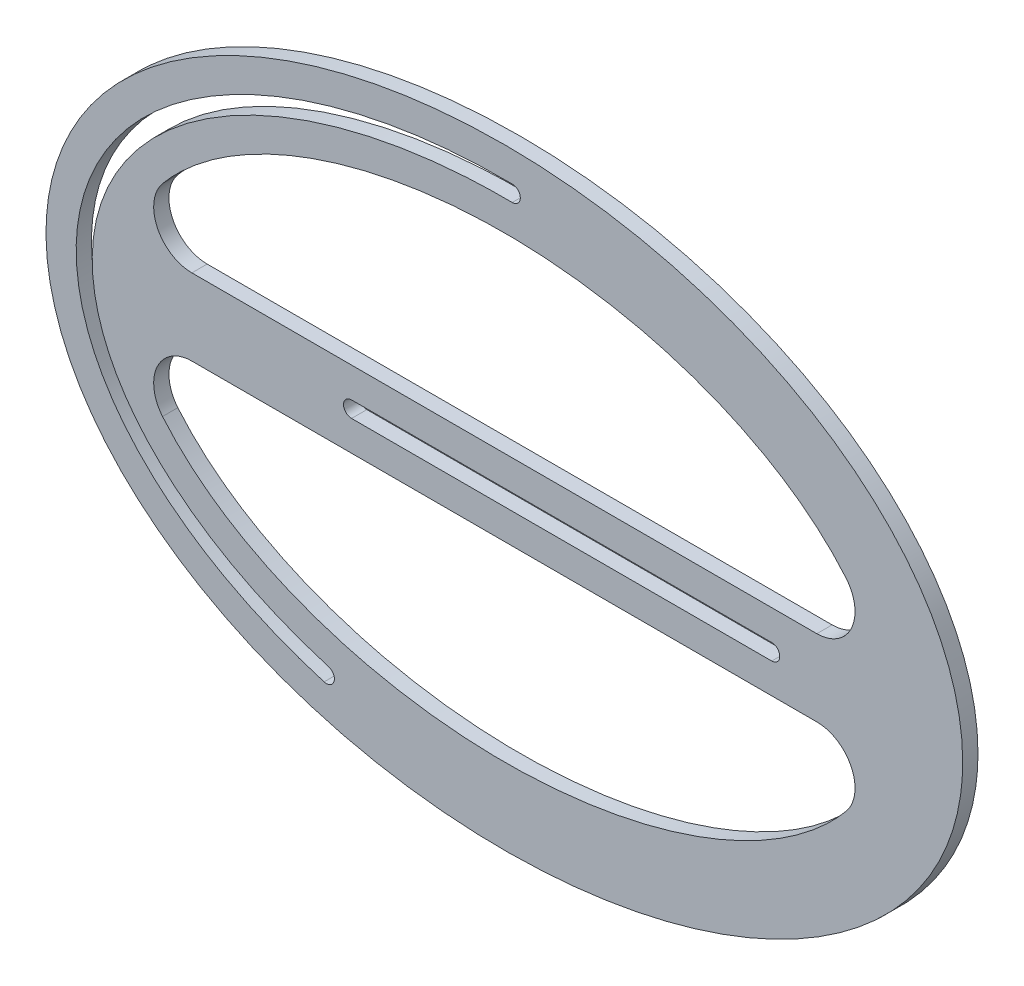
ISO-10303-21;
HEADER;
FILE_DESCRIPTION(('STEP AP214'),'2;1');
FILE_NAME('part.step','',(''),(''),'','','');
FILE_SCHEMA(('AUTOMOTIVE_DESIGN { 1 0 10303 214 1 1 1 1 }'));
ENDSEC;
DATA;
#1=APPLICATION_CONTEXT('core data for automotive mechanical design processes');
#2=APPLICATION_PROTOCOL_DEFINITION('international standard','automotive_design',2000,#1);
#3=PRODUCT_CONTEXT('',#1,'mechanical');
#4=PRODUCT('Part','Part','',(#3));
#5=PRODUCT_RELATED_PRODUCT_CATEGORY('part','',(#4));
#6=PRODUCT_DEFINITION_FORMATION('','',#4);
#7=PRODUCT_DEFINITION_CONTEXT('part definition',#1,'design');
#8=PRODUCT_DEFINITION('design','',#6,#7);
#9=PRODUCT_DEFINITION_SHAPE('','',#8);
#10=(LENGTH_UNIT() NAMED_UNIT(*) SI_UNIT(.MILLI.,.METRE.));
#11=(NAMED_UNIT(*) PLANE_ANGLE_UNIT() SI_UNIT($,.RADIAN.));
#12=(NAMED_UNIT(*) SI_UNIT($,.STERADIAN.) SOLID_ANGLE_UNIT());
#13=UNCERTAINTY_MEASURE_WITH_UNIT(LENGTH_MEASURE(1.E-05),#10,'distance_accuracy_value','');
#14=(GEOMETRIC_REPRESENTATION_CONTEXT(3) GLOBAL_UNCERTAINTY_ASSIGNED_CONTEXT((#13)) GLOBAL_UNIT_ASSIGNED_CONTEXT((#10,
#11,#12)) REPRESENTATION_CONTEXT('',''));
#15=CARTESIAN_POINT('',(0.,0.,0.));
#16=DIRECTION('',(0.,0.,1.));
#17=DIRECTION('',(1.,0.,0.));
#18=AXIS2_PLACEMENT_3D('',#15,#16,#17);
#19=CARTESIAN_POINT('',(100.,0.,2.));
#20=CARTESIAN_POINT('',(100.,3.55452568872866,2.));
#21=CARTESIAN_POINT('',(98.9138891933027,10.663577066186,2.));
#22=CARTESIAN_POINT('',(93.8521228578576,21.3831322021362,2.));
#23=CARTESIAN_POINT('',(85.1523454379762,31.7995776859009,2.));
#24=CARTESIAN_POINT('',(72.9290258901977,41.3098774176984,2.));
#25=CARTESIAN_POINT('',(57.6094970527651,49.3260714777289,2.));
#26=CARTESIAN_POINT('',(33.9052788591471,57.4076909095641,2.));
#27=CARTESIAN_POINT('',(0.,61.7282060602906,2.));
#28=CARTESIAN_POINT('',(-33.9052788591471,57.4076909095641,2.));
#29=CARTESIAN_POINT('',(-57.609497052765,49.3260714777288,2.));
#30=CARTESIAN_POINT('',(-72.9290258901977,41.3098774176984,2.));
#31=CARTESIAN_POINT('',(-85.1523454379762,31.7995776859009,2.));
#32=CARTESIAN_POINT('',(-93.8521228578576,21.3831322021362,2.));
#33=CARTESIAN_POINT('',(-98.9138891933027,10.663577066186,2.));
#34=CARTESIAN_POINT('',(-100.543055403349,0.,2.));
#35=CARTESIAN_POINT('',(-98.9138891933026,-10.663577066186,2.));
#36=CARTESIAN_POINT('',(-93.8521228578577,-21.3831322021362,2.));
#37=CARTESIAN_POINT('',(-85.1523454379762,-31.7995776859009,2.));
#38=CARTESIAN_POINT('',(-72.9290258901977,-41.3098774176984,2.));
#39=CARTESIAN_POINT('',(-57.6094970527651,-49.3260714777288,2.));
#40=CARTESIAN_POINT('',(-33.9052788591471,-57.4076909095641,2.));
#41=CARTESIAN_POINT('',(0.,-61.7282060602906,2.));
#42=CARTESIAN_POINT('',(33.9052788591471,-57.4076909095641,2.));
#43=CARTESIAN_POINT('',(57.609497052765,-49.3260714777288,2.));
#44=CARTESIAN_POINT('',(72.9290258901977,-41.3098774176984,2.));
#45=CARTESIAN_POINT('',(85.1523454379761,-31.799577685901,2.));
#46=CARTESIAN_POINT('',(93.8521228578577,-21.3831322021362,2.));
#47=CARTESIAN_POINT('',(98.9138891933026,-10.663577066186,2.));
#48=CARTESIAN_POINT('',(100.,-3.55452568872867,2.));
#49=CARTESIAN_POINT('',(100.,0.,2.));
#50=B_SPLINE_CURVE_WITH_KNOTS('',3,(#19,#20,#21,#22,#23,#24,#25,#26,#27,#28,#29,#30,#31,#32,#33,
#34,#35,#36,#37,#38,#39,#40,#41,#42,#43,#44,#45,#46,#47,#48,#49),.UNSPECIFIED.,.T.,.F.,(4,1,1,1,
1,1,1,1,1,1,1,1,1,1,1,1,1,1,1,1,1,1,1,1,1,1,1,1,4),(0.,0.196349540849362,0.392699081698724,
0.589048622548086,0.785398163397448,0.98174770424681,1.17809724509617,1.5707963267949,
1.96349540849362,2.15984494934298,2.35619449019234,2.55254403104171,2.74889357189107,
2.94524311274043,3.14159265358979,3.33794219443916,3.53429173528852,3.73064127613788,
3.92699081698724,4.1233403578366,4.31968989868597,4.71238898038469,5.10508806208341,
5.30143760293278,5.49778714378214,5.6941366846315,5.89048622548086,6.08683576633022,
6.28318530717959),.UNSPECIFIED.);
#51=DIRECTION('',(0.,0.,-1.));
#52=VECTOR('',#51,1.);
#53=SURFACE_OF_LINEAR_EXTRUSION('',#50,#52);
#54=CARTESIAN_POINT('',(-89.4891679912321,-26.4034784966226,2.));
#55=VERTEX_POINT('',#54);
#56=CARTESIAN_POINT('',(89.489167991232,-26.4034784966227,2.));
#57=VERTEX_POINT('',#56);
#58=EDGE_CURVE('E311',#55,#57,#50,.T.);
#59=ORIENTED_EDGE('',*,*,#58,.T.);
#60=DIRECTION('',(0.,0.,-1.));
#61=VECTOR('',#60,1.);
#62=CARTESIAN_POINT('',(89.489167991232,-26.4034784966227,2.));
#63=LINE('',#62,#61);
#64=CARTESIAN_POINT('',(89.489167991232,-26.4034784966227,-2.));
#65=VERTEX_POINT('',#64);
#66=EDGE_CURVE('E384',#57,#65,#63,.T.);
#67=ORIENTED_EDGE('',*,*,#66,.T.);
#68=CARTESIAN_POINT('',(100.,0.,-2.));
#69=CARTESIAN_POINT('',(100.,3.55452568872866,-2.));
#70=CARTESIAN_POINT('',(98.9138891933027,10.663577066186,-2.));
#71=CARTESIAN_POINT('',(93.8521228578576,21.3831322021362,-2.));
#72=CARTESIAN_POINT('',(85.1523454379762,31.7995776859009,-2.));
#73=CARTESIAN_POINT('',(72.9290258901977,41.3098774176984,-2.));
#74=CARTESIAN_POINT('',(57.6094970527651,49.3260714777289,-2.));
#75=CARTESIAN_POINT('',(33.9052788591471,57.4076909095641,-2.));
#76=CARTESIAN_POINT('',(0.,61.7282060602906,-2.));
#77=CARTESIAN_POINT('',(-33.9052788591471,57.4076909095641,-2.));
#78=CARTESIAN_POINT('',(-57.609497052765,49.3260714777288,-2.));
#79=CARTESIAN_POINT('',(-72.9290258901977,41.3098774176984,-2.));
#80=CARTESIAN_POINT('',(-85.1523454379762,31.7995776859009,-2.));
#81=CARTESIAN_POINT('',(-93.8521228578576,21.3831322021362,-2.));
#82=CARTESIAN_POINT('',(-98.9138891933027,10.663577066186,-2.));
#83=CARTESIAN_POINT('',(-100.543055403349,0.,-2.));
#84=CARTESIAN_POINT('',(-98.9138891933026,-10.663577066186,-2.));
#85=CARTESIAN_POINT('',(-93.8521228578577,-21.3831322021362,-2.));
#86=CARTESIAN_POINT('',(-85.1523454379762,-31.7995776859009,-2.));
#87=CARTESIAN_POINT('',(-72.9290258901977,-41.3098774176984,-2.));
#88=CARTESIAN_POINT('',(-57.6094970527651,-49.3260714777288,-2.));
#89=CARTESIAN_POINT('',(-33.9052788591471,-57.4076909095641,-2.));
#90=CARTESIAN_POINT('',(0.,-61.7282060602906,-2.));
#91=CARTESIAN_POINT('',(33.9052788591471,-57.4076909095641,-2.));
#92=CARTESIAN_POINT('',(57.609497052765,-49.3260714777288,-2.));
#93=CARTESIAN_POINT('',(72.9290258901977,-41.3098774176984,-2.));
#94=CARTESIAN_POINT('',(85.1523454379761,-31.799577685901,-2.));
#95=CARTESIAN_POINT('',(93.8521228578577,-21.3831322021362,-2.));
#96=CARTESIAN_POINT('',(98.9138891933026,-10.663577066186,-2.));
#97=CARTESIAN_POINT('',(100.,-3.55452568872867,-2.));
#98=CARTESIAN_POINT('',(100.,0.,-2.));
#99=B_SPLINE_CURVE_WITH_KNOTS('',3,(#68,#69,#70,#71,#72,#73,#74,#75,#76,#77,#78,#79,#80,#81,#82,
#83,#84,#85,#86,#87,#88,#89,#90,#91,#92,#93,#94,#95,#96,#97,#98),.UNSPECIFIED.,.T.,.F.,(4,1,1,1,
1,1,1,1,1,1,1,1,1,1,1,1,1,1,1,1,1,1,1,1,1,1,1,1,4),(0.,0.196349540849362,0.392699081698724,
0.589048622548086,0.785398163397448,0.98174770424681,1.17809724509617,1.5707963267949,
1.96349540849362,2.15984494934298,2.35619449019234,2.55254403104171,2.74889357189107,
2.94524311274043,3.14159265358979,3.33794219443916,3.53429173528852,3.73064127613788,
3.92699081698724,4.1233403578366,4.31968989868597,4.71238898038469,5.10508806208341,
5.30143760293278,5.49778714378214,5.6941366846315,5.89048622548086,6.08683576633022,
6.28318530717959),.UNSPECIFIED.);
#100=CARTESIAN_POINT('',(-89.4891679912321,-26.4034784966226,-2.));
#101=VERTEX_POINT('',#100);
#102=EDGE_CURVE('E323',#101,#65,#99,.T.);
#103=ORIENTED_EDGE('',*,*,#102,.F.);
#104=DIRECTION('',(0.,0.,-1.));
#105=VECTOR('',#104,1.);
#106=CARTESIAN_POINT('',(-89.4891679912321,-26.4034784966226,-2.));
#107=LINE('',#106,#105);
#108=EDGE_CURVE('E387',#101,#55,#107,.F.);
#109=ORIENTED_EDGE('',*,*,#108,.T.);
#110=EDGE_LOOP('',(#59,#67,#103,#109));
#111=FACE_BOUND('',#110,.T.);
#112=ADVANCED_FACE('F57',(#111),#53,.T.);
#113=CARTESIAN_POINT('',(-120.,0.,2.));
#114=DIRECTION('',(0.,0.,-1.));
#115=DIRECTION('',(-1.,0.,0.));
#116=AXIS2_PLACEMENT_3D('',#113,#114,#115);
#117=PLANE('',#116);
#118=DIRECTION('',(1.,0.,0.));
#119=VECTOR('',#118,1.);
#120=CARTESIAN_POINT('',(-40.,-2.1,2.));
#121=LINE('',#120,#119);
#122=CARTESIAN_POINT('',(-40.,-2.1,2.));
#123=VERTEX_POINT('',#122);
#124=CARTESIAN_POINT('',(70.,-2.09999999999998,2.));
#125=VERTEX_POINT('',#124);
#126=EDGE_CURVE('E234',#123,#125,#121,.T.);
#127=ORIENTED_EDGE('',*,*,#126,.F.);
#128=CARTESIAN_POINT('',(-40.,0.,2.));
#129=DIRECTION('',(0.,0.,1.));
#130=DIRECTION('',(1.,0.,0.));
#131=AXIS2_PLACEMENT_3D('',#128,#129,#130);
#132=CIRCLE('',#131,2.1);
#133=CARTESIAN_POINT('',(-40.,2.1,2.));
#134=VERTEX_POINT('',#133);
#135=EDGE_CURVE('E240',#134,#123,#132,.T.);
#136=ORIENTED_EDGE('',*,*,#135,.F.);
#137=DIRECTION('',(-1.,0.,0.));
#138=VECTOR('',#137,1.);
#139=CARTESIAN_POINT('',(-40.,2.1,2.));
#140=LINE('',#139,#138);
#141=CARTESIAN_POINT('',(70.,2.10000000000002,2.));
#142=VERTEX_POINT('',#141);
#143=EDGE_CURVE('E244',#142,#134,#140,.T.);
#144=ORIENTED_EDGE('',*,*,#143,.F.);
#145=CARTESIAN_POINT('',(70.,0.,2.));
#146=DIRECTION('',(0.,0.,1.));
#147=DIRECTION('',(1.,0.,0.));
#148=AXIS2_PLACEMENT_3D('',#145,#146,#147);
#149=CIRCLE('',#148,2.1);
#150=EDGE_CURVE('E222',#125,#142,#149,.T.);
#151=ORIENTED_EDGE('',*,*,#150,.F.);
#152=EDGE_LOOP('',(#127,#136,#144,#151));
#153=FACE_BOUND('',#152,.T.);
#154=CARTESIAN_POINT('',(2.07629801618386,69.9874737524133,2.));
#155=DIRECTION('',(0.,0.,-1.));
#156=DIRECTION('',(-1.,0.,0.));
#157=AXIS2_PLACEMENT_3D('',#154,#155,#156);
#158=CIRCLE('',#157,2.1);
#159=CARTESIAN_POINT('',(2.10142726215118,72.0873233948871,2.));
#160=VERTEX_POINT('',#159);
#161=CARTESIAN_POINT('',(4.17568457840183,69.9367188277396,2.));
#162=VERTEX_POINT('',#161);
#163=EDGE_CURVE('E466',#160,#162,#158,.T.);
#164=ORIENTED_EDGE('',*,*,#163,.T.);
#165=CARTESIAN_POINT('',(2.07629792702465,69.9874700645021,2.));
#166=DIRECTION('',(0.,0.,-1.));
#167=DIRECTION('',(-1.,0.,0.));
#168=AXIS2_PLACEMENT_3D('',#165,#166,#167);
#169=CIRCLE('',#168,2.1);
#170=CARTESIAN_POINT('',(2.05117519981623,67.8876203440274,2.));
#171=VERTEX_POINT('',#170);
#172=EDGE_CURVE('E471',#162,#171,#169,.T.);
#173=ORIENTED_EDGE('',*,*,#172,.T.);
#174=CARTESIAN_POINT('',(-44.0056818239766,-61.9737632172946,2.));
#175=CARTESIAN_POINT('',(-45.4238606673335,-61.5737305547639,2.));
#176=CARTESIAN_POINT('',(-48.2603499056449,-60.7267452837837,2.));
#177=CARTESIAN_POINT('',(-53.7813952717234,-58.8884871139168,2.));
#178=CARTESIAN_POINT('',(-60.4432611079557,-56.3085696023602,2.));
#179=CARTESIAN_POINT('',(-67.9729968814889,-52.7920451013287,2.));
#180=CARTESIAN_POINT('',(-77.3248739171352,-47.579038076013,2.));
#181=CARTESIAN_POINT('',(-87.5869033047087,-40.1594313813924,2.));
#182=CARTESIAN_POINT('',(-97.2530750916108,-30.103801291565,2.));
#183=CARTESIAN_POINT('',(-104.006165257759,-19.2271844201019,2.));
#184=CARTESIAN_POINT('',(-108.924460755741,-4.07953196371148,2.));
#185=CARTESIAN_POINT('',(-107.265727293647,15.3192353851775,2.));
#186=CARTESIAN_POINT('',(-92.8192461903909,37.1433574182495,2.));
#187=CARTESIAN_POINT('',(-71.4945118665523,51.8620549345535,2.));
#188=CARTESIAN_POINT('',(-50.3868762344104,60.399589228256,2.));
#189=CARTESIAN_POINT('',(-33.025936973881,64.9892229316607,2.));
#190=CARTESIAN_POINT('',(-14.6675599564208,67.6151125814292,2.));
#191=CARTESIAN_POINT('',(-2.11393454607107,68.0009907980665,2.));
#192=CARTESIAN_POINT('',(4.12523958610341,67.8501520631694,2.));
#193=B_SPLINE_CURVE_WITH_KNOTS('',3,(#174,#175,#176,#177,#178,#179,#180,#181,#182,#183,#184,
#185,#186,#187,#188,#189,#190,#191,#192),.UNSPECIFIED.,.F.,.F.,(4,1,1,1,1,1,1,1,1,1,1,1,1,1,1,1,
4),(-1.60876903824375,-1.56560763089935,-1.52244622355495,-1.43612340886616,-1.34980059417736,
-1.26347777948857,-1.09083215011098,-0.918186520733392,-0.745540891355803,-0.572895261978214,
-0.227604003223037,0.117687255532141,0.462978514287319,0.635624143664908,0.808269773042497,
0.980915402420086,1.15356103179767),.UNSPECIFIED.);
#194=CARTESIAN_POINT('',(-45.9938940113434,-61.3975562299335,2.));
#195=VERTEX_POINT('',#194);
#196=EDGE_CURVE('E256',#195,#171,#193,.T.);
#197=ORIENTED_EDGE('',*,*,#196,.F.);
#198=CARTESIAN_POINT('',(-46.5928468043653,-63.4103293298459,2.));
#199=DIRECTION('',(0.,0.,-1.));
#200=DIRECTION('',(-1.,0.,0.));
#201=AXIS2_PLACEMENT_3D('',#198,#199,#200);
#202=CIRCLE('',#201,2.1);
#203=CARTESIAN_POINT('',(-44.5717149594898,-63.980439903007,2.));
#204=VERTEX_POINT('',#203);
#205=EDGE_CURVE('E85',#195,#204,#202,.T.);
#206=ORIENTED_EDGE('',*,*,#205,.T.);
#207=CARTESIAN_POINT('',(-46.5928477421218,-63.4103326543406,2.));
#208=DIRECTION('',(0.,0.,-1.));
#209=DIRECTION('',(-1.,0.,0.));
#210=AXIS2_PLACEMENT_3D('',#207,#208,#209);
#211=CIRCLE('',#210,2.1);
#212=CARTESIAN_POINT('',(-47.1917985336607,-65.4231063498451,2.));
#213=VERTEX_POINT('',#212);
#214=EDGE_CURVE('E67',#204,#213,#211,.T.);
#215=ORIENTED_EDGE('',*,*,#214,.T.);
#216=CARTESIAN_POINT('',(4.2267494354509,72.0489251876053,2.));
#217=CARTESIAN_POINT('',(-2.16655572989241,72.2034902057506,2.));
#218=CARTESIAN_POINT('',(-15.0268583594118,71.8082923939363,2.));
#219=CARTESIAN_POINT('',(-33.8542445418859,69.1161903813619,2.));
#220=CARTESIAN_POINT('',(-51.7031344796899,64.3997947482921,2.));
#221=CARTESIAN_POINT('',(-73.4972763222923,55.5870585463929,2.));
#222=CARTESIAN_POINT('',(-95.7690966917872,40.2712085704439,2.));
#223=CARTESIAN_POINT('',(-108.753782536943,20.7977147237653,2.));
#224=CARTESIAN_POINT('',(-112.498680523617,4.04983235177222,2.));
#225=CARTESIAN_POINT('',(-111.871960538631,-8.65394962539672,2.));
#226=CARTESIAN_POINT('',(-107.836151502222,-21.0502963531823,2.));
#227=CARTESIAN_POINT('',(-100.567006326947,-32.733684024488,2.));
#228=CARTESIAN_POINT('',(-90.3290633649762,-43.3697792852495,2.));
#229=CARTESIAN_POINT('',(-79.5959399831508,-51.1231391454755,2.));
#230=CARTESIAN_POINT('',(-69.8817285211462,-56.537296625925,2.));
#231=CARTESIAN_POINT('',(-62.0878987171337,-60.1765999448417,2.));
#232=CARTESIAN_POINT('',(-55.2126090532504,-62.8388701192126,2.));
#233=CARTESIAN_POINT('',(-49.5239316189691,-64.7328656935595,2.));
#234=CARTESIAN_POINT('',(-46.6055469284552,-65.6042979761965,2.));
#235=CARTESIAN_POINT('',(-45.1459029702987,-66.0160269070456,2.));
#236=B_SPLINE_CURVE_WITH_KNOTS('',3,(#216,#217,#218,#219,#220,#221,#222,#223,#224,#225,#226,
#227,#228,#229,#230,#231,#232,#233,#234,#235),.UNSPECIFIED.,.F.,.F.,(4,1,1,1,1,1,1,1,1,1,1,1,1,
1,1,1,1,4),(-1.60876903824375,-1.43612340886616,-1.26347777948857,-1.09083215011098,
-0.918186520733392,-0.572895261978214,-0.227604003223037,-0.0549583738454478,0.117687255532141,
0.29033288490973,0.462978514287319,0.635624143664908,0.808269773042497,0.894592587731291,
0.980915402420086,1.06723821710888,1.11039962445328,1.15356103179767),.UNSPECIFIED.);
#237=EDGE_CURVE('E269',#160,#213,#236,.T.);
#238=ORIENTED_EDGE('',*,*,#237,.F.);
#239=EDGE_LOOP('',(#164,#173,#197,#206,#215,#238));
#240=FACE_BOUND('',#239,.T.);
#241=ORIENTED_EDGE('',*,*,#58,.F.);
#242=CARTESIAN_POINT('',(-81.8083175732581,-19.9999999999999,2.));
#243=DIRECTION('',(0.,0.,-1.));
#244=DIRECTION('',(-1.,0.,0.));
#245=AXIS2_PLACEMENT_3D('',#242,#243,#244);
#246=CIRCLE('',#245,10.);
#247=CARTESIAN_POINT('',(-81.8083175732581,-10.,2.));
#248=VERTEX_POINT('',#247);
#249=EDGE_CURVE('E438',#55,#248,#246,.T.);
#250=ORIENTED_EDGE('',*,*,#249,.T.);
#251=DIRECTION('',(1.,0.,0.));
#252=VECTOR('',#251,1.);
#253=CARTESIAN_POINT('',(110.,-10.,2.));
#254=LINE('',#253,#252);
#255=CARTESIAN_POINT('',(81.8083175732581,-10.,2.));
#256=VERTEX_POINT('',#255);
#257=EDGE_CURVE('E519',#248,#256,#254,.T.);
#258=ORIENTED_EDGE('',*,*,#257,.T.);
#259=CARTESIAN_POINT('',(81.8083175732581,-20.,2.));
#260=DIRECTION('',(0.,0.,-1.));
#261=DIRECTION('',(-1.,0.,0.));
#262=AXIS2_PLACEMENT_3D('',#259,#260,#261);
#263=CIRCLE('',#262,10.);
#264=EDGE_CURVE('E393',#256,#57,#263,.T.);
#265=ORIENTED_EDGE('',*,*,#264,.T.);
#266=EDGE_LOOP('',(#241,#250,#258,#265));
#267=FACE_BOUND('',#266,.T.);
#268=CARTESIAN_POINT('',(89.4891679912319,26.4034784966228,2.));
#269=VERTEX_POINT('',#268);
#270=CARTESIAN_POINT('',(-89.4891679912321,26.4034784966226,2.));
#271=VERTEX_POINT('',#270);
#272=EDGE_CURVE('E302',#269,#271,#50,.T.);
#273=ORIENTED_EDGE('',*,*,#272,.F.);
#274=CARTESIAN_POINT('',(81.808317573258,20.0000000000001,2.));
#275=DIRECTION('',(0.,0.,-1.));
#276=DIRECTION('',(-1.,0.,0.));
#277=AXIS2_PLACEMENT_3D('',#274,#275,#276);
#278=CIRCLE('',#277,10.);
#279=CARTESIAN_POINT('',(81.808317573258,10.,2.));
#280=VERTEX_POINT('',#279);
#281=EDGE_CURVE('E427',#269,#280,#278,.T.);
#282=ORIENTED_EDGE('',*,*,#281,.T.);
#283=DIRECTION('',(-1.,0.,0.));
#284=VECTOR('',#283,1.);
#285=CARTESIAN_POINT('',(110.,10.,2.));
#286=LINE('',#285,#284);
#287=CARTESIAN_POINT('',(-81.8083175732581,10.,2.));
#288=VERTEX_POINT('',#287);
#289=EDGE_CURVE('E511',#280,#288,#286,.T.);
#290=ORIENTED_EDGE('',*,*,#289,.T.);
#291=CARTESIAN_POINT('',(-81.8083175732581,20.,2.));
#292=DIRECTION('',(0.,0.,-1.));
#293=DIRECTION('',(-1.,0.,0.));
#294=AXIS2_PLACEMENT_3D('',#291,#292,#293);
#295=CIRCLE('',#294,10.);
#296=EDGE_CURVE('E430',#288,#271,#295,.T.);
#297=ORIENTED_EDGE('',*,*,#296,.T.);
#298=EDGE_LOOP('',(#273,#282,#290,#297));
#299=FACE_BOUND('',#298,.T.);
#300=CARTESIAN_POINT('',(120.,0.,2.));
#301=CARTESIAN_POINT('',(120.,5.60837091024374,2.));
#302=CARTESIAN_POINT('',(118.249749071403,16.8251127307312,2.));
#303=CARTESIAN_POINT('',(110.711713347938,32.5379791037427,2.));
#304=CARTESIAN_POINT('',(98.949654389036,46.4813704803415,2.));
#305=CARTESIAN_POINT('',(78.5354843174125,62.2718289704446,2.));
#306=CARTESIAN_POINT('',(45.6898819848852,76.1580302699827,2.));
#307=CARTESIAN_POINT('',(0.,81.9209848650086,2.));
#308=CARTESIAN_POINT('',(-45.6898819848852,76.1580302699827,2.));
#309=CARTESIAN_POINT('',(-78.5354843174124,62.2718289704445,2.));
#310=CARTESIAN_POINT('',(-98.949654389036,46.4813704803415,2.));
#311=CARTESIAN_POINT('',(-110.711713347938,32.5379791037428,2.));
#312=CARTESIAN_POINT('',(-118.249749071403,16.8251127307312,2.));
#313=CARTESIAN_POINT('',(-120.875125464299,0.,2.));
#314=CARTESIAN_POINT('',(-118.249749071403,-16.8251127307312,2.));
#315=CARTESIAN_POINT('',(-110.711713347938,-32.5379791037427,2.));
#316=CARTESIAN_POINT('',(-98.949654389036,-46.4813704803415,2.));
#317=CARTESIAN_POINT('',(-78.5354843174125,-62.2718289704445,2.));
#318=CARTESIAN_POINT('',(-45.6898819848853,-76.1580302699826,2.));
#319=CARTESIAN_POINT('',(0.,-81.9209848650087,2.));
#320=CARTESIAN_POINT('',(45.6898819848852,-76.1580302699826,2.));
#321=CARTESIAN_POINT('',(78.5354843174125,-62.2718289704446,2.));
#322=CARTESIAN_POINT('',(98.949654389036,-46.4813704803415,2.));
#323=CARTESIAN_POINT('',(110.711713347938,-32.5379791037428,2.));
#324=CARTESIAN_POINT('',(118.249749071403,-16.8251127307313,2.));
#325=CARTESIAN_POINT('',(120.,-5.60837091024375,2.));
#326=CARTESIAN_POINT('',(120.,0.,2.));
#327=B_SPLINE_CURVE_WITH_KNOTS('',3,(#300,#301,#302,#303,#304,#305,#306,#307,#308,#309,#310,
#311,#312,#313,#314,#315,#316,#317,#318,#319,#320,#321,#322,#323,#324,#325,#326),.UNSPECIFIED.,
.T.,.F.,(4,1,1,1,1,1,1,1,1,1,1,1,1,1,1,1,1,1,1,1,1,1,1,1,4),(0.,0.196349540849362,
0.392699081698724,0.589048622548086,0.785398163397448,1.17809724509617,1.5707963267949,
1.96349540849362,2.35619449019234,2.55254403104171,2.74889357189107,2.94524311274043,
3.14159265358979,3.33794219443916,3.53429173528852,3.73064127613788,3.92699081698724,
4.31968989868597,4.71238898038469,5.10508806208341,5.49778714378214,5.6941366846315,
5.89048622548086,6.08683576633022,6.28318530717959),.UNSPECIFIED.);
#328=CARTESIAN_POINT('',(120.,0.,2.));
#329=VERTEX_POINT('',#328);
#330=EDGE_CURVE('E324',#329,#329,#327,.T.);
#331=ORIENTED_EDGE('',*,*,#330,.T.);
#332=EDGE_LOOP('',(#331));
#333=FACE_BOUND('',#332,.T.);
#334=ADVANCED_FACE('F242',(#153,#240,#267,#299,#333),#117,.F.);
#335=CARTESIAN_POINT('',(-120.,0.,-2.));
#336=DIRECTION('',(0.,0.,-1.));
#337=DIRECTION('',(-1.,0.,0.));
#338=AXIS2_PLACEMENT_3D('',#335,#336,#337);
#339=PLANE('',#338);
#340=CARTESIAN_POINT('',(-40.,0.,-2.));
#341=DIRECTION('',(0.,0.,-1.));
#342=DIRECTION('',(-1.,0.,0.));
#343=AXIS2_PLACEMENT_3D('',#340,#341,#342);
#344=CIRCLE('',#343,2.1);
#345=CARTESIAN_POINT('',(-40.,-2.1,-2.));
#346=VERTEX_POINT('',#345);
#347=CARTESIAN_POINT('',(-40.,2.1,-2.));
#348=VERTEX_POINT('',#347);
#349=EDGE_CURVE('E449',#346,#348,#344,.T.);
#350=ORIENTED_EDGE('',*,*,#349,.F.);
#351=DIRECTION('',(-1.,0.,0.));
#352=VECTOR('',#351,1.);
#353=CARTESIAN_POINT('',(-120.,-2.10000000000002,-2.));
#354=LINE('',#353,#352);
#355=CARTESIAN_POINT('',(70.,-2.09999999999998,-2.));
#356=VERTEX_POINT('',#355);
#357=EDGE_CURVE('E441',#356,#346,#354,.T.);
#358=ORIENTED_EDGE('',*,*,#357,.F.);
#359=CARTESIAN_POINT('',(70.,0.,-2.));
#360=DIRECTION('',(0.,0.,-1.));
#361=DIRECTION('',(-1.,0.,0.));
#362=AXIS2_PLACEMENT_3D('',#359,#360,#361);
#363=CIRCLE('',#362,2.1);
#364=CARTESIAN_POINT('',(70.,2.10000000000002,-2.));
#365=VERTEX_POINT('',#364);
#366=EDGE_CURVE('E225',#365,#356,#363,.T.);
#367=ORIENTED_EDGE('',*,*,#366,.F.);
#368=DIRECTION('',(1.,0.,0.));
#369=VECTOR('',#368,1.);
#370=CARTESIAN_POINT('',(-120.,2.09999999999999,-2.));
#371=LINE('',#370,#369);
#372=EDGE_CURVE('E446',#348,#365,#371,.T.);
#373=ORIENTED_EDGE('',*,*,#372,.F.);
#374=EDGE_LOOP('',(#350,#358,#367,#373));
#375=FACE_BOUND('',#374,.T.);
#376=CARTESIAN_POINT('',(4.2267494354509,72.0489251876053,-2.));
#377=CARTESIAN_POINT('',(-2.16655572989241,72.2034902057506,-2.));
#378=CARTESIAN_POINT('',(-15.0268583594118,71.8082923939363,-2.));
#379=CARTESIAN_POINT('',(-33.8542445418859,69.1161903813619,-2.));
#380=CARTESIAN_POINT('',(-51.7031344796899,64.3997947482921,-2.));
#381=CARTESIAN_POINT('',(-73.4972763222923,55.5870585463929,-2.));
#382=CARTESIAN_POINT('',(-95.7690966917872,40.2712085704439,-2.));
#383=CARTESIAN_POINT('',(-108.753782536943,20.7977147237653,-2.));
#384=CARTESIAN_POINT('',(-112.498680523617,4.04983235177222,-2.));
#385=CARTESIAN_POINT('',(-111.871960538631,-8.65394962539672,-2.));
#386=CARTESIAN_POINT('',(-107.836151502222,-21.0502963531823,-2.));
#387=CARTESIAN_POINT('',(-100.567006326947,-32.733684024488,-2.));
#388=CARTESIAN_POINT('',(-90.3290633649762,-43.3697792852495,-2.));
#389=CARTESIAN_POINT('',(-79.5959399831508,-51.1231391454755,-2.));
#390=CARTESIAN_POINT('',(-69.8817285211462,-56.537296625925,-2.));
#391=CARTESIAN_POINT('',(-62.0878987171337,-60.1765999448417,-2.));
#392=CARTESIAN_POINT('',(-55.2126090532504,-62.8388701192126,-2.));
#393=CARTESIAN_POINT('',(-49.5239316189691,-64.7328656935595,-2.));
#394=CARTESIAN_POINT('',(-46.6055469284552,-65.6042979761965,-2.));
#395=CARTESIAN_POINT('',(-45.1459029702987,-66.0160269070456,-2.));
#396=B_SPLINE_CURVE_WITH_KNOTS('',3,(#376,#377,#378,#379,#380,#381,#382,#383,#384,#385,#386,
#387,#388,#389,#390,#391,#392,#393,#394,#395),.UNSPECIFIED.,.F.,.F.,(4,1,1,1,1,1,1,1,1,1,1,1,1,
1,1,1,1,4),(-1.60876903824375,-1.43612340886616,-1.26347777948857,-1.09083215011098,
-0.918186520733392,-0.572895261978214,-0.227604003223037,-0.0549583738454478,0.117687255532141,
0.29033288490973,0.462978514287319,0.635624143664908,0.808269773042497,0.894592587731291,
0.980915402420086,1.06723821710888,1.11039962445328,1.15356103179767),.UNSPECIFIED.);
#397=CARTESIAN_POINT('',(2.10142726215118,72.0873233948871,-2.));
#398=VERTEX_POINT('',#397);
#399=CARTESIAN_POINT('',(-47.1917985336607,-65.4231063498451,-2.));
#400=VERTEX_POINT('',#399);
#401=EDGE_CURVE('E268',#398,#400,#396,.T.);
#402=ORIENTED_EDGE('',*,*,#401,.T.);
#403=CARTESIAN_POINT('',(-46.5928477421218,-63.4103326543406,-2.));
#404=DIRECTION('',(0.,0.,-1.));
#405=DIRECTION('',(-1.,0.,0.));
#406=AXIS2_PLACEMENT_3D('',#403,#404,#405);
#407=CIRCLE('',#406,2.1);
#408=CARTESIAN_POINT('',(-44.5717149594898,-63.980439903007,-2.));
#409=VERTEX_POINT('',#408);
#410=EDGE_CURVE('E13',#400,#409,#407,.F.);
#411=ORIENTED_EDGE('',*,*,#410,.T.);
#412=CARTESIAN_POINT('',(-46.5928468043653,-63.4103293298459,-2.));
#413=DIRECTION('',(0.,0.,-1.));
#414=DIRECTION('',(-1.,0.,0.));
#415=AXIS2_PLACEMENT_3D('',#412,#413,#414);
#416=CIRCLE('',#415,2.1);
#417=CARTESIAN_POINT('',(-45.9938940113434,-61.3975562299335,-2.));
#418=VERTEX_POINT('',#417);
#419=EDGE_CURVE('E479',#409,#418,#416,.F.);
#420=ORIENTED_EDGE('',*,*,#419,.T.);
#421=CARTESIAN_POINT('',(-44.0056818239766,-61.9737632172946,-2.));
#422=CARTESIAN_POINT('',(-45.4238606673335,-61.5737305547639,-2.));
#423=CARTESIAN_POINT('',(-48.2603499056449,-60.7267452837837,-2.));
#424=CARTESIAN_POINT('',(-53.7813952717234,-58.8884871139168,-2.));
#425=CARTESIAN_POINT('',(-60.4432611079557,-56.3085696023602,-2.));
#426=CARTESIAN_POINT('',(-67.9729968814889,-52.7920451013287,-2.));
#427=CARTESIAN_POINT('',(-77.3248739171352,-47.579038076013,-2.));
#428=CARTESIAN_POINT('',(-87.5869033047087,-40.1594313813924,-2.));
#429=CARTESIAN_POINT('',(-97.2530750916108,-30.103801291565,-2.));
#430=CARTESIAN_POINT('',(-104.006165257759,-19.2271844201019,-2.));
#431=CARTESIAN_POINT('',(-108.924460755741,-4.07953196371148,-2.));
#432=CARTESIAN_POINT('',(-107.265727293647,15.3192353851775,-2.));
#433=CARTESIAN_POINT('',(-92.8192461903909,37.1433574182495,-2.));
#434=CARTESIAN_POINT('',(-71.4945118665523,51.8620549345535,-2.));
#435=CARTESIAN_POINT('',(-50.3868762344104,60.399589228256,-2.));
#436=CARTESIAN_POINT('',(-33.025936973881,64.9892229316607,-2.));
#437=CARTESIAN_POINT('',(-14.6675599564208,67.6151125814292,-2.));
#438=CARTESIAN_POINT('',(-2.11393454607107,68.0009907980665,-2.));
#439=CARTESIAN_POINT('',(4.12523958610341,67.8501520631694,-2.));
#440=B_SPLINE_CURVE_WITH_KNOTS('',3,(#421,#422,#423,#424,#425,#426,#427,#428,#429,#430,#431,
#432,#433,#434,#435,#436,#437,#438,#439),.UNSPECIFIED.,.F.,.F.,(4,1,1,1,1,1,1,1,1,1,1,1,1,1,1,1,
4),(-1.60876903824375,-1.56560763089935,-1.52244622355495,-1.43612340886616,-1.34980059417736,
-1.26347777948857,-1.09083215011098,-0.918186520733392,-0.745540891355803,-0.572895261978214,
-0.227604003223037,0.117687255532141,0.462978514287319,0.635624143664908,0.808269773042497,
0.980915402420086,1.15356103179767),.UNSPECIFIED.);
#441=CARTESIAN_POINT('',(2.05117519981623,67.8876203440274,-2.));
#442=VERTEX_POINT('',#441);
#443=EDGE_CURVE('E261',#418,#442,#440,.T.);
#444=ORIENTED_EDGE('',*,*,#443,.T.);
#445=CARTESIAN_POINT('',(2.07629792702465,69.9874700645021,-2.));
#446=DIRECTION('',(0.,0.,-1.));
#447=DIRECTION('',(-1.,0.,0.));
#448=AXIS2_PLACEMENT_3D('',#445,#446,#447);
#449=CIRCLE('',#448,2.1);
#450=CARTESIAN_POINT('',(4.17568457840183,69.9367188277396,-2.));
#451=VERTEX_POINT('',#450);
#452=EDGE_CURVE('E474',#442,#451,#449,.F.);
#453=ORIENTED_EDGE('',*,*,#452,.T.);
#454=CARTESIAN_POINT('',(2.07629801618386,69.9874737524133,-2.));
#455=DIRECTION('',(0.,0.,-1.));
#456=DIRECTION('',(-1.,0.,0.));
#457=AXIS2_PLACEMENT_3D('',#454,#455,#456);
#458=CIRCLE('',#457,2.1);
#459=EDGE_CURVE('E468',#451,#398,#458,.F.);
#460=ORIENTED_EDGE('',*,*,#459,.T.);
#461=EDGE_LOOP('',(#402,#411,#420,#444,#453,#460));
#462=FACE_BOUND('',#461,.T.);
#463=DIRECTION('',(1.,0.,0.));
#464=VECTOR('',#463,1.);
#465=CARTESIAN_POINT('',(110.,-10.,-2.));
#466=LINE('',#465,#464);
#467=CARTESIAN_POINT('',(-81.8083175732581,-10.,-2.));
#468=VERTEX_POINT('',#467);
#469=CARTESIAN_POINT('',(81.8083175732581,-10.,-2.));
#470=VERTEX_POINT('',#469);
#471=EDGE_CURVE('E518',#468,#470,#466,.T.);
#472=ORIENTED_EDGE('',*,*,#471,.F.);
#473=CARTESIAN_POINT('',(-81.8083175732581,-19.9999999999999,-2.));
#474=DIRECTION('',(0.,0.,-1.));
#475=DIRECTION('',(-1.,0.,0.));
#476=AXIS2_PLACEMENT_3D('',#473,#474,#475);
#477=CIRCLE('',#476,10.);
#478=EDGE_CURVE('E435',#468,#101,#477,.F.);
#479=ORIENTED_EDGE('',*,*,#478,.T.);
#480=ORIENTED_EDGE('',*,*,#102,.T.);
#481=CARTESIAN_POINT('',(81.8083175732581,-20.,-2.));
#482=DIRECTION('',(0.,0.,-1.));
#483=DIRECTION('',(-1.,0.,0.));
#484=AXIS2_PLACEMENT_3D('',#481,#482,#483);
#485=CIRCLE('',#484,10.);
#486=EDGE_CURVE('E395',#65,#470,#485,.F.);
#487=ORIENTED_EDGE('',*,*,#486,.T.);
#488=EDGE_LOOP('',(#472,#479,#480,#487));
#489=FACE_BOUND('',#488,.T.);
#490=DIRECTION('',(-1.,0.,0.));
#491=VECTOR('',#490,1.);
#492=CARTESIAN_POINT('',(110.,10.,-2.));
#493=LINE('',#492,#491);
#494=CARTESIAN_POINT('',(81.808317573258,10.,-2.));
#495=VERTEX_POINT('',#494);
#496=CARTESIAN_POINT('',(-81.8083175732581,10.,-2.));
#497=VERTEX_POINT('',#496);
#498=EDGE_CURVE('E312',#495,#497,#493,.T.);
#499=ORIENTED_EDGE('',*,*,#498,.F.);
#500=CARTESIAN_POINT('',(81.808317573258,20.0000000000001,-2.));
#501=DIRECTION('',(0.,0.,-1.));
#502=DIRECTION('',(-1.,0.,0.));
#503=AXIS2_PLACEMENT_3D('',#500,#501,#502);
#504=CIRCLE('',#503,10.);
#505=CARTESIAN_POINT('',(89.4891679912319,26.4034784966228,-2.));
#506=VERTEX_POINT('',#505);
#507=EDGE_CURVE('E424',#495,#506,#504,.F.);
#508=ORIENTED_EDGE('',*,*,#507,.T.);
#509=CARTESIAN_POINT('',(-89.4891679912321,26.4034784966226,-2.));
#510=VERTEX_POINT('',#509);
#511=EDGE_CURVE('E314',#506,#510,#99,.T.);
#512=ORIENTED_EDGE('',*,*,#511,.T.);
#513=CARTESIAN_POINT('',(-81.8083175732581,20.,-2.));
#514=DIRECTION('',(0.,0.,-1.));
#515=DIRECTION('',(-1.,0.,0.));
#516=AXIS2_PLACEMENT_3D('',#513,#514,#515);
#517=CIRCLE('',#516,10.);
#518=EDGE_CURVE('E432',#510,#497,#517,.F.);
#519=ORIENTED_EDGE('',*,*,#518,.T.);
#520=EDGE_LOOP('',(#499,#508,#512,#519));
#521=FACE_BOUND('',#520,.T.);
#522=CARTESIAN_POINT('',(120.,0.,-2.));
#523=CARTESIAN_POINT('',(120.,5.60837091024374,-2.));
#524=CARTESIAN_POINT('',(118.249749071403,16.8251127307312,-2.));
#525=CARTESIAN_POINT('',(110.711713347938,32.5379791037427,-2.));
#526=CARTESIAN_POINT('',(98.949654389036,46.4813704803415,-2.));
#527=CARTESIAN_POINT('',(78.5354843174125,62.2718289704446,-2.));
#528=CARTESIAN_POINT('',(45.6898819848852,76.1580302699827,-2.));
#529=CARTESIAN_POINT('',(0.,81.9209848650086,-2.));
#530=CARTESIAN_POINT('',(-45.6898819848852,76.1580302699827,-2.));
#531=CARTESIAN_POINT('',(-78.5354843174124,62.2718289704445,-2.));
#532=CARTESIAN_POINT('',(-98.949654389036,46.4813704803415,-2.));
#533=CARTESIAN_POINT('',(-110.711713347938,32.5379791037428,-2.));
#534=CARTESIAN_POINT('',(-118.249749071403,16.8251127307312,-2.));
#535=CARTESIAN_POINT('',(-120.875125464299,0.,-2.));
#536=CARTESIAN_POINT('',(-118.249749071403,-16.8251127307312,-2.));
#537=CARTESIAN_POINT('',(-110.711713347938,-32.5379791037427,-2.));
#538=CARTESIAN_POINT('',(-98.949654389036,-46.4813704803415,-2.));
#539=CARTESIAN_POINT('',(-78.5354843174125,-62.2718289704445,-2.));
#540=CARTESIAN_POINT('',(-45.6898819848853,-76.1580302699826,-2.));
#541=CARTESIAN_POINT('',(0.,-81.9209848650087,-2.));
#542=CARTESIAN_POINT('',(45.6898819848852,-76.1580302699826,-2.));
#543=CARTESIAN_POINT('',(78.5354843174125,-62.2718289704446,-2.));
#544=CARTESIAN_POINT('',(98.949654389036,-46.4813704803415,-2.));
#545=CARTESIAN_POINT('',(110.711713347938,-32.5379791037428,-2.));
#546=CARTESIAN_POINT('',(118.249749071403,-16.8251127307313,-2.));
#547=CARTESIAN_POINT('',(120.,-5.60837091024375,-2.));
#548=CARTESIAN_POINT('',(120.,0.,-2.));
#549=B_SPLINE_CURVE_WITH_KNOTS('',3,(#522,#523,#524,#525,#526,#527,#528,#529,#530,#531,#532,
#533,#534,#535,#536,#537,#538,#539,#540,#541,#542,#543,#544,#545,#546,#547,#548),.UNSPECIFIED.,
.T.,.F.,(4,1,1,1,1,1,1,1,1,1,1,1,1,1,1,1,1,1,1,1,1,1,1,1,4),(0.,0.196349540849362,
0.392699081698724,0.589048622548086,0.785398163397448,1.17809724509617,1.5707963267949,
1.96349540849362,2.35619449019234,2.55254403104171,2.74889357189107,2.94524311274043,
3.14159265358979,3.33794219443916,3.53429173528852,3.73064127613788,3.92699081698724,
4.31968989868597,4.71238898038469,5.10508806208341,5.49778714378214,5.6941366846315,
5.89048622548086,6.08683576633022,6.28318530717959),.UNSPECIFIED.);
#550=CARTESIAN_POINT('',(120.,0.,-2.));
#551=VERTEX_POINT('',#550);
#552=EDGE_CURVE('E310',#551,#551,#549,.T.);
#553=ORIENTED_EDGE('',*,*,#552,.F.);
#554=EDGE_LOOP('',(#553));
#555=FACE_BOUND('',#554,.T.);
#556=ADVANCED_FACE('F344',(#375,#462,#489,#521,#555),#339,.T.);
#557=DIRECTION('',(0.,0.,-1.));
#558=VECTOR('',#557,1.);
#559=SURFACE_OF_LINEAR_EXTRUSION('',#327,#558);
#560=ORIENTED_EDGE('',*,*,#330,.F.);
#561=EDGE_LOOP('',(#560));
#562=FACE_BOUND('',#561,.T.);
#563=ORIENTED_EDGE('',*,*,#552,.T.);
#564=EDGE_LOOP('',(#563));
#565=FACE_BOUND('',#564,.T.);
#566=ADVANCED_FACE('F299',(#562,#565),#559,.F.);
#567=ORIENTED_EDGE('',*,*,#511,.F.);
#568=DIRECTION('',(0.,0.,-1.));
#569=VECTOR('',#568,1.);
#570=CARTESIAN_POINT('',(89.4891679912319,26.4034784966228,-2.));
#571=LINE('',#570,#569);
#572=EDGE_CURVE('E417',#506,#269,#571,.F.);
#573=ORIENTED_EDGE('',*,*,#572,.T.);
#574=ORIENTED_EDGE('',*,*,#272,.T.);
#575=DIRECTION('',(0.,0.,-1.));
#576=VECTOR('',#575,1.);
#577=CARTESIAN_POINT('',(-89.4891679912321,26.4034784966226,2.));
#578=LINE('',#577,#576);
#579=EDGE_CURVE('E414',#271,#510,#578,.T.);
#580=ORIENTED_EDGE('',*,*,#579,.T.);
#581=EDGE_LOOP('',(#567,#573,#574,#580));
#582=FACE_BOUND('',#581,.T.);
#583=ADVANCED_FACE('F294',(#582),#53,.T.);
#584=CARTESIAN_POINT('',(110.,-10.,-222.907220343746));
#585=DIRECTION('',(0.,-1.,0.));
#586=DIRECTION('',(1.,0.,0.));
#587=AXIS2_PLACEMENT_3D('',#584,#585,#586);
#588=PLANE('',#587);
#589=ORIENTED_EDGE('',*,*,#471,.T.);
#590=DIRECTION('',(0.,0.,1.));
#591=VECTOR('',#590,1.);
#592=CARTESIAN_POINT('',(81.8083175732581,-10.,2.));
#593=LINE('',#592,#591);
#594=EDGE_CURVE('E407',#470,#256,#593,.T.);
#595=ORIENTED_EDGE('',*,*,#594,.T.);
#596=ORIENTED_EDGE('',*,*,#257,.F.);
#597=DIRECTION('',(0.,0.,1.));
#598=VECTOR('',#597,1.);
#599=CARTESIAN_POINT('',(-81.8083175732581,-10.,-2.));
#600=LINE('',#599,#598);
#601=EDGE_CURVE('E334',#248,#468,#600,.F.);
#602=ORIENTED_EDGE('',*,*,#601,.T.);
#603=EDGE_LOOP('',(#589,#595,#596,#602));
#604=FACE_BOUND('',#603,.T.);
#605=ADVANCED_FACE('F290',(#604),#588,.T.);
#606=CARTESIAN_POINT('',(110.,10.,-222.907220343746));
#607=DIRECTION('',(0.,1.,0.));
#608=DIRECTION('',(-1.,0.,0.));
#609=AXIS2_PLACEMENT_3D('',#606,#607,#608);
#610=PLANE('',#609);
#611=ORIENTED_EDGE('',*,*,#289,.F.);
#612=DIRECTION('',(0.,0.,1.));
#613=VECTOR('',#612,1.);
#614=CARTESIAN_POINT('',(81.808317573258,10.,-2.));
#615=LINE('',#614,#613);
#616=EDGE_CURVE('E404',#280,#495,#615,.F.);
#617=ORIENTED_EDGE('',*,*,#616,.T.);
#618=ORIENTED_EDGE('',*,*,#498,.T.);
#619=DIRECTION('',(0.,0.,1.));
#620=VECTOR('',#619,1.);
#621=CARTESIAN_POINT('',(-81.8083175732581,10.,2.));
#622=LINE('',#621,#620);
#623=EDGE_CURVE('E397',#497,#288,#622,.T.);
#624=ORIENTED_EDGE('',*,*,#623,.T.);
#625=EDGE_LOOP('',(#611,#617,#618,#624));
#626=FACE_BOUND('',#625,.T.);
#627=ADVANCED_FACE('F286',(#626),#610,.T.);
#628=CARTESIAN_POINT('',(81.8083175732581,-20.,0.));
#629=DIRECTION('',(0.,0.,-1.));
#630=DIRECTION('',(-1.,0.,0.));
#631=AXIS2_PLACEMENT_3D('',#628,#629,#630);
#632=CYLINDRICAL_SURFACE('',#631,10.);
#633=ORIENTED_EDGE('',*,*,#486,.F.);
#634=ORIENTED_EDGE('',*,*,#66,.F.);
#635=ORIENTED_EDGE('',*,*,#264,.F.);
#636=ORIENTED_EDGE('',*,*,#594,.F.);
#637=EDGE_LOOP('',(#633,#634,#635,#636));
#638=FACE_BOUND('',#637,.T.);
#639=ADVANCED_FACE('F289',(#638),#632,.F.);
#640=CARTESIAN_POINT('',(81.808317573258,20.0000000000001,0.));
#641=DIRECTION('',(0.,0.,-1.));
#642=DIRECTION('',(-1.,0.,0.));
#643=AXIS2_PLACEMENT_3D('',#640,#641,#642);
#644=CYLINDRICAL_SURFACE('',#643,10.);
#645=ORIENTED_EDGE('',*,*,#281,.F.);
#646=ORIENTED_EDGE('',*,*,#572,.F.);
#647=ORIENTED_EDGE('',*,*,#507,.F.);
#648=ORIENTED_EDGE('',*,*,#616,.F.);
#649=EDGE_LOOP('',(#645,#646,#647,#648));
#650=FACE_BOUND('',#649,.T.);
#651=ADVANCED_FACE('F348',(#650),#644,.F.);
#652=CARTESIAN_POINT('',(-81.8083175732581,20.,0.));
#653=DIRECTION('',(0.,0.,-1.));
#654=DIRECTION('',(-1.,0.,0.));
#655=AXIS2_PLACEMENT_3D('',#652,#653,#654);
#656=CYLINDRICAL_SURFACE('',#655,10.);
#657=ORIENTED_EDGE('',*,*,#518,.F.);
#658=ORIENTED_EDGE('',*,*,#579,.F.);
#659=ORIENTED_EDGE('',*,*,#296,.F.);
#660=ORIENTED_EDGE('',*,*,#623,.F.);
#661=EDGE_LOOP('',(#657,#658,#659,#660));
#662=FACE_BOUND('',#661,.T.);
#663=ADVANCED_FACE('F352',(#662),#656,.F.);
#664=CARTESIAN_POINT('',(-81.8083175732581,-19.9999999999999,0.));
#665=DIRECTION('',(0.,0.,-1.));
#666=DIRECTION('',(-1.,0.,0.));
#667=AXIS2_PLACEMENT_3D('',#664,#665,#666);
#668=CYLINDRICAL_SURFACE('',#667,10.);
#669=ORIENTED_EDGE('',*,*,#249,.F.);
#670=ORIENTED_EDGE('',*,*,#108,.F.);
#671=ORIENTED_EDGE('',*,*,#478,.F.);
#672=ORIENTED_EDGE('',*,*,#601,.F.);
#673=EDGE_LOOP('',(#669,#670,#671,#672));
#674=FACE_BOUND('',#673,.T.);
#675=ADVANCED_FACE('F283',(#674),#668,.F.);
#676=DIRECTION('',(0.,0.,1.));
#677=VECTOR('',#676,1.);
#678=SURFACE_OF_LINEAR_EXTRUSION('',#440,#677);
#679=ORIENTED_EDGE('',*,*,#196,.T.);
#680=DIRECTION('',(0.,0.,1.));
#681=VECTOR('',#680,1.);
#682=CARTESIAN_POINT('',(2.05117519981623,67.8876203440274,2.));
#683=LINE('',#682,#681);
#684=EDGE_CURVE('E463',#171,#442,#683,.F.);
#685=ORIENTED_EDGE('',*,*,#684,.T.);
#686=ORIENTED_EDGE('',*,*,#443,.F.);
#687=DIRECTION('',(0.,0.,1.));
#688=VECTOR('',#687,1.);
#689=CARTESIAN_POINT('',(-45.9938940113434,-61.3975562299335,-2.));
#690=LINE('',#689,#688);
#691=EDGE_CURVE('E459',#418,#195,#690,.T.);
#692=ORIENTED_EDGE('',*,*,#691,.T.);
#693=EDGE_LOOP('',(#679,#685,#686,#692));
#694=FACE_BOUND('',#693,.T.);
#695=ADVANCED_FACE('F278',(#694),#678,.F.);
#696=DIRECTION('',(0.,0.,1.));
#697=VECTOR('',#696,1.);
#698=SURFACE_OF_LINEAR_EXTRUSION('',#396,#697);
#699=ORIENTED_EDGE('',*,*,#401,.F.);
#700=DIRECTION('',(0.,0.,1.));
#701=VECTOR('',#700,1.);
#702=CARTESIAN_POINT('',(2.10142726215118,72.0873233948871,-2.));
#703=LINE('',#702,#701);
#704=EDGE_CURVE('E455',#398,#160,#703,.T.);
#705=ORIENTED_EDGE('',*,*,#704,.T.);
#706=ORIENTED_EDGE('',*,*,#237,.T.);
#707=DIRECTION('',(0.,0.,1.));
#708=VECTOR('',#707,1.);
#709=CARTESIAN_POINT('',(-47.1917985336607,-65.4231063498451,2.));
#710=LINE('',#709,#708);
#711=EDGE_CURVE('E452',#213,#400,#710,.F.);
#712=ORIENTED_EDGE('',*,*,#711,.T.);
#713=EDGE_LOOP('',(#699,#705,#706,#712));
#714=FACE_BOUND('',#713,.T.);
#715=ADVANCED_FACE('F282',(#714),#698,.F.);
#716=CARTESIAN_POINT('',(-40.,0.,-48.));
#717=DIRECTION('',(0.,0.,1.));
#718=DIRECTION('',(1.,0.,0.));
#719=AXIS2_PLACEMENT_3D('',#716,#717,#718);
#720=CYLINDRICAL_SURFACE('',#719,2.1);
#721=ORIENTED_EDGE('',*,*,#349,.T.);
#722=DIRECTION('',(0.,0.,1.));
#723=VECTOR('',#722,1.);
#724=CARTESIAN_POINT('',(-40.,2.1,-48.));
#725=LINE('',#724,#723);
#726=EDGE_CURVE('E254',#348,#134,#725,.T.);
#727=ORIENTED_EDGE('',*,*,#726,.T.);
#728=ORIENTED_EDGE('',*,*,#135,.T.);
#729=DIRECTION('',(0.,0.,1.));
#730=VECTOR('',#729,1.);
#731=CARTESIAN_POINT('',(-40.,-2.1,-48.));
#732=LINE('',#731,#730);
#733=EDGE_CURVE('E230',#346,#123,#732,.T.);
#734=ORIENTED_EDGE('',*,*,#733,.F.);
#735=EDGE_LOOP('',(#721,#727,#728,#734));
#736=FACE_BOUND('',#735,.T.);
#737=ADVANCED_FACE('F603',(#736),#720,.F.);
#738=CARTESIAN_POINT('',(-40.,2.1,-48.));
#739=DIRECTION('',(0.,1.,0.));
#740=DIRECTION('',(-1.,0.,0.));
#741=AXIS2_PLACEMENT_3D('',#738,#739,#740);
#742=PLANE('',#741);
#743=ORIENTED_EDGE('',*,*,#372,.T.);
#744=DIRECTION('',(0.,0.,1.));
#745=VECTOR('',#744,1.);
#746=CARTESIAN_POINT('',(70.,2.10000000000002,-48.));
#747=LINE('',#746,#745);
#748=EDGE_CURVE('E229',#365,#142,#747,.T.);
#749=ORIENTED_EDGE('',*,*,#748,.T.);
#750=ORIENTED_EDGE('',*,*,#143,.T.);
#751=ORIENTED_EDGE('',*,*,#726,.F.);
#752=EDGE_LOOP('',(#743,#749,#750,#751));
#753=FACE_BOUND('',#752,.T.);
#754=ADVANCED_FACE('F605',(#753),#742,.F.);
#755=CARTESIAN_POINT('',(70.,0.,-48.));
#756=DIRECTION('',(0.,0.,1.));
#757=DIRECTION('',(1.,0.,0.));
#758=AXIS2_PLACEMENT_3D('',#755,#756,#757);
#759=CYLINDRICAL_SURFACE('',#758,2.1);
#760=ORIENTED_EDGE('',*,*,#366,.T.);
#761=DIRECTION('',(0.,0.,1.));
#762=VECTOR('',#761,1.);
#763=CARTESIAN_POINT('',(70.,-2.09999999999998,-48.));
#764=LINE('',#763,#762);
#765=EDGE_CURVE('E217',#356,#125,#764,.T.);
#766=ORIENTED_EDGE('',*,*,#765,.T.);
#767=ORIENTED_EDGE('',*,*,#150,.T.);
#768=ORIENTED_EDGE('',*,*,#748,.F.);
#769=EDGE_LOOP('',(#760,#766,#767,#768));
#770=FACE_BOUND('',#769,.T.);
#771=ADVANCED_FACE('F219',(#770),#759,.F.);
#772=CARTESIAN_POINT('',(-40.,-2.1,-48.));
#773=DIRECTION('',(0.,-1.,0.));
#774=DIRECTION('',(1.,0.,0.));
#775=AXIS2_PLACEMENT_3D('',#772,#773,#774);
#776=PLANE('',#775);
#777=ORIENTED_EDGE('',*,*,#357,.T.);
#778=ORIENTED_EDGE('',*,*,#733,.T.);
#779=ORIENTED_EDGE('',*,*,#126,.T.);
#780=ORIENTED_EDGE('',*,*,#765,.F.);
#781=EDGE_LOOP('',(#777,#778,#779,#780));
#782=FACE_BOUND('',#781,.T.);
#783=ADVANCED_FACE('F235',(#782),#776,.F.);
#784=CARTESIAN_POINT('',(2.07629792702465,69.9874700645021,0.));
#785=DIRECTION('',(0.,0.,1.));
#786=DIRECTION('',(1.,0.,0.));
#787=AXIS2_PLACEMENT_3D('',#784,#785,#786);
#788=CYLINDRICAL_SURFACE('',#787,2.1);
#789=DIRECTION('',(0.,0.,-1.));
#790=VECTOR('',#789,1.);
#791=CARTESIAN_POINT('',(4.17568448924262,69.9367151398283,2.));
#792=LINE('',#791,#790);
#793=EDGE_CURVE('E483',#451,#162,#792,.F.);
#794=ORIENTED_EDGE('',*,*,#793,.F.);
#795=ORIENTED_EDGE('',*,*,#452,.F.);
#796=ORIENTED_EDGE('',*,*,#684,.F.);
#797=ORIENTED_EDGE('',*,*,#172,.F.);
#798=EDGE_LOOP('',(#794,#795,#796,#797));
#799=FACE_BOUND('',#798,.T.);
#800=ADVANCED_FACE('F363',(#799),#788,.F.);
#801=CARTESIAN_POINT('',(2.07629801618386,69.9874737524133,0.));
#802=DIRECTION('',(0.,0.,1.));
#803=DIRECTION('',(1.,0.,0.));
#804=AXIS2_PLACEMENT_3D('',#801,#802,#803);
#805=CYLINDRICAL_SURFACE('',#804,2.1);
#806=ORIENTED_EDGE('',*,*,#459,.F.);
#807=ORIENTED_EDGE('',*,*,#793,.T.);
#808=ORIENTED_EDGE('',*,*,#163,.F.);
#809=ORIENTED_EDGE('',*,*,#704,.F.);
#810=EDGE_LOOP('',(#806,#807,#808,#809));
#811=FACE_BOUND('',#810,.T.);
#812=ADVANCED_FACE('F360',(#811),#805,.F.);
#813=CARTESIAN_POINT('',(-46.5928477421218,-63.4103326543406,0.));
#814=DIRECTION('',(0.,0.,1.));
#815=DIRECTION('',(1.,0.,0.));
#816=AXIS2_PLACEMENT_3D('',#813,#814,#815);
#817=CYLINDRICAL_SURFACE('',#816,2.1);
#818=DIRECTION('',(0.,0.,-1.));
#819=VECTOR('',#818,1.);
#820=CARTESIAN_POINT('',(-44.5717158972463,-63.9804432275016,2.));
#821=LINE('',#820,#819);
#822=EDGE_CURVE('E61',#409,#204,#821,.F.);
#823=ORIENTED_EDGE('',*,*,#822,.F.);
#824=ORIENTED_EDGE('',*,*,#410,.F.);
#825=ORIENTED_EDGE('',*,*,#711,.F.);
#826=ORIENTED_EDGE('',*,*,#214,.F.);
#827=EDGE_LOOP('',(#823,#824,#825,#826));
#828=FACE_BOUND('',#827,.T.);
#829=ADVANCED_FACE('F59',(#828),#817,.F.);
#830=CARTESIAN_POINT('',(-46.5928468043653,-63.4103293298459,0.));
#831=DIRECTION('',(0.,0.,1.));
#832=DIRECTION('',(1.,0.,0.));
#833=AXIS2_PLACEMENT_3D('',#830,#831,#832);
#834=CYLINDRICAL_SURFACE('',#833,2.1);
#835=ORIENTED_EDGE('',*,*,#419,.F.);
#836=ORIENTED_EDGE('',*,*,#822,.T.);
#837=ORIENTED_EDGE('',*,*,#205,.F.);
#838=ORIENTED_EDGE('',*,*,#691,.F.);
#839=EDGE_LOOP('',(#835,#836,#837,#838));
#840=FACE_BOUND('',#839,.T.);
#841=ADVANCED_FACE('F367',(#840),#834,.F.);
#842=CLOSED_SHELL('',(#112,#334,#556,#566,#583,#605,#627,#639,#651,#663,#675,#695,#715,#737,
#754,#771,#783,#800,#812,#829,#841));
#843=MANIFOLD_SOLID_BREP('B2',#842);
#844=ADVANCED_BREP_SHAPE_REPRESENTATION('',(#18,#843),#14);
#845=SHAPE_DEFINITION_REPRESENTATION(#9,#844);
ENDSEC;
END-ISO-10303-21;
